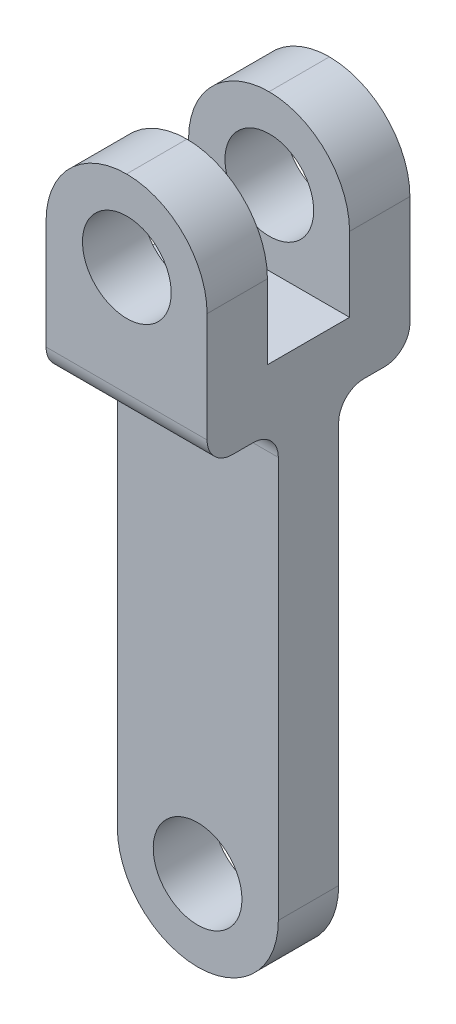
ISO-10303-21;
HEADER;
FILE_DESCRIPTION(('STEP AP214'),'2;1');
FILE_NAME('part.step','',(''),(''),'','','');
FILE_SCHEMA(('AUTOMOTIVE_DESIGN { 1 0 10303 214 1 1 1 1 }'));
ENDSEC;
DATA;
#1=APPLICATION_CONTEXT('core data for automotive mechanical design processes');
#2=APPLICATION_PROTOCOL_DEFINITION('international standard','automotive_design',2000,#1);
#3=PRODUCT_CONTEXT('',#1,'mechanical');
#4=PRODUCT('Part','Part','',(#3));
#5=PRODUCT_RELATED_PRODUCT_CATEGORY('part','',(#4));
#6=PRODUCT_DEFINITION_FORMATION('','',#4);
#7=PRODUCT_DEFINITION_CONTEXT('part definition',#1,'design');
#8=PRODUCT_DEFINITION('design','',#6,#7);
#9=PRODUCT_DEFINITION_SHAPE('','',#8);
#10=(LENGTH_UNIT() NAMED_UNIT(*) SI_UNIT(.MILLI.,.METRE.));
#11=(NAMED_UNIT(*) PLANE_ANGLE_UNIT() SI_UNIT($,.RADIAN.));
#12=(NAMED_UNIT(*) SI_UNIT($,.STERADIAN.) SOLID_ANGLE_UNIT());
#13=UNCERTAINTY_MEASURE_WITH_UNIT(LENGTH_MEASURE(1.E-05),#10,'distance_accuracy_value','');
#14=(GEOMETRIC_REPRESENTATION_CONTEXT(3) GLOBAL_UNCERTAINTY_ASSIGNED_CONTEXT((#13)) GLOBAL_UNIT_ASSIGNED_CONTEXT((#10,
#11,#12)) REPRESENTATION_CONTEXT('',''));
#15=CARTESIAN_POINT('',(0.,0.,0.));
#16=DIRECTION('',(0.,0.,1.));
#17=DIRECTION('',(1.,0.,0.));
#18=AXIS2_PLACEMENT_3D('',#15,#16,#17);
#19=CARTESIAN_POINT('',(6.35,0.,8.));
#20=DIRECTION('',(0.,1.,0.));
#21=DIRECTION('',(0.,0.,-1.));
#22=AXIS2_PLACEMENT_3D('',#19,#20,#21);
#23=PLANE('',#22);
#24=DIRECTION('',(0.,0.,1.));
#25=VECTOR('',#24,1.);
#26=CARTESIAN_POINT('',(6.35,0.,8.));
#27=LINE('',#26,#25);
#28=CARTESIAN_POINT('',(6.35,0.,4.38));
#29=VERTEX_POINT('',#28);
#30=CARTESIAN_POINT('',(6.35,0.,6.));
#31=VERTEX_POINT('',#30);
#32=EDGE_CURVE('E204',#29,#31,#27,.T.);
#33=ORIENTED_EDGE('',*,*,#32,.T.);
#34=DIRECTION('',(-1.,0.,0.));
#35=VECTOR('',#34,1.);
#36=CARTESIAN_POINT('',(6.35,0.,6.));
#37=LINE('',#36,#35);
#38=CARTESIAN_POINT('',(-6.35,0.,6.));
#39=VERTEX_POINT('',#38);
#40=EDGE_CURVE('E297',#39,#31,#37,.F.);
#41=ORIENTED_EDGE('',*,*,#40,.F.);
#42=DIRECTION('',(0.,0.,1.));
#43=VECTOR('',#42,1.);
#44=CARTESIAN_POINT('',(-6.35,0.,8.));
#45=LINE('',#44,#43);
#46=CARTESIAN_POINT('',(-6.35,0.,4.38));
#47=VERTEX_POINT('',#46);
#48=EDGE_CURVE('E220',#47,#39,#45,.T.);
#49=ORIENTED_EDGE('',*,*,#48,.F.);
#50=DIRECTION('',(1.,0.,0.));
#51=VECTOR('',#50,1.);
#52=CARTESIAN_POINT('',(-6.35,0.,4.38));
#53=LINE('',#52,#51);
#54=EDGE_CURVE('E299',#29,#47,#53,.F.);
#55=ORIENTED_EDGE('',*,*,#54,.F.);
#56=EDGE_LOOP('',(#33,#41,#49,#55));
#57=FACE_BOUND('',#56,.T.);
#58=ADVANCED_FACE('F35',(#57),#23,.F.);
#59=CARTESIAN_POINT('',(6.35,17.,8.));
#60=DIRECTION('',(0.,0.,-1.));
#61=DIRECTION('',(0.,-1.,0.));
#62=AXIS2_PLACEMENT_3D('',#59,#60,#61);
#63=PLANE('',#62);
#64=CARTESIAN_POINT('',(0.0200000000000001,10.63,8.));
#65=DIRECTION('',(0.,0.,-1.));
#66=DIRECTION('',(0.,1.,0.));
#67=AXIS2_PLACEMENT_3D('',#64,#65,#66);
#68=CIRCLE('',#67,3.5);
#69=CARTESIAN_POINT('',(0.0200000000000001,14.13,8.));
#70=VERTEX_POINT('',#69);
#71=EDGE_CURVE('E338',#70,#70,#68,.T.);
#72=ORIENTED_EDGE('',*,*,#71,.T.);
#73=EDGE_LOOP('',(#72));
#74=FACE_BOUND('',#73,.T.);
#75=DIRECTION('',(0.,1.,0.));
#76=VECTOR('',#75,1.);
#77=CARTESIAN_POINT('',(6.35,17.,8.));
#78=LINE('',#77,#76);
#79=CARTESIAN_POINT('',(6.35,2.,8.));
#80=VERTEX_POINT('',#79);
#81=CARTESIAN_POINT('',(6.35,10.63,8.));
#82=VERTEX_POINT('',#81);
#83=EDGE_CURVE('E193',#80,#82,#78,.T.);
#84=ORIENTED_EDGE('',*,*,#83,.T.);
#85=CARTESIAN_POINT('',(-0.0200000000000001,10.63,8.));
#86=DIRECTION('',(0.,0.,1.));
#87=DIRECTION('',(0.,-1.,0.));
#88=AXIS2_PLACEMENT_3D('',#85,#86,#87);
#89=CIRCLE('',#88,6.37);
#90=CARTESIAN_POINT('',(0.,16.9999686027484,8.));
#91=VERTEX_POINT('',#90);
#92=EDGE_CURVE('E227',#91,#82,#89,.F.);
#93=ORIENTED_EDGE('',*,*,#92,.F.);
#94=CARTESIAN_POINT('',(0.0200000000000001,10.63,8.));
#95=DIRECTION('',(0.,0.,1.));
#96=DIRECTION('',(0.,-1.,0.));
#97=AXIS2_PLACEMENT_3D('',#94,#95,#96);
#98=CIRCLE('',#97,6.37);
#99=CARTESIAN_POINT('',(-6.35,10.63,8.));
#100=VERTEX_POINT('',#99);
#101=EDGE_CURVE('E230',#100,#91,#98,.F.);
#102=ORIENTED_EDGE('',*,*,#101,.F.);
#103=DIRECTION('',(0.,1.,0.));
#104=VECTOR('',#103,1.);
#105=CARTESIAN_POINT('',(-6.35,17.,8.));
#106=LINE('',#105,#104);
#107=CARTESIAN_POINT('',(-6.35,2.,8.));
#108=VERTEX_POINT('',#107);
#109=EDGE_CURVE('E208',#108,#100,#106,.T.);
#110=ORIENTED_EDGE('',*,*,#109,.F.);
#111=DIRECTION('',(-1.,0.,0.));
#112=VECTOR('',#111,1.);
#113=CARTESIAN_POINT('',(6.35,2.,8.));
#114=LINE('',#113,#112);
#115=EDGE_CURVE('E302',#80,#108,#114,.T.);
#116=ORIENTED_EDGE('',*,*,#115,.F.);
#117=EDGE_LOOP('',(#84,#93,#102,#110,#116));
#118=FACE_BOUND('',#117,.T.);
#119=ADVANCED_FACE('F358',(#74,#118),#63,.F.);
#120=CARTESIAN_POINT('',(6.35,17.,3.24));
#121=DIRECTION('',(0.,0.,-1.));
#122=DIRECTION('',(0.,-1.,0.));
#123=AXIS2_PLACEMENT_3D('',#120,#121,#122);
#124=PLANE('',#123);
#125=CARTESIAN_POINT('',(0.0200000000000001,10.63,3.24));
#126=DIRECTION('',(0.,0.,1.));
#127=DIRECTION('',(0.,-1.,0.));
#128=AXIS2_PLACEMENT_3D('',#125,#126,#127);
#129=CIRCLE('',#128,3.5);
#130=CARTESIAN_POINT('',(0.0200000000000001,7.13,3.24));
#131=VERTEX_POINT('',#130);
#132=EDGE_CURVE('E257',#131,#131,#129,.T.);
#133=ORIENTED_EDGE('',*,*,#132,.T.);
#134=EDGE_LOOP('',(#133));
#135=FACE_BOUND('',#134,.T.);
#136=CARTESIAN_POINT('',(-0.0200000000000001,10.63,3.24));
#137=DIRECTION('',(0.,0.,1.));
#138=DIRECTION('',(0.,-1.,0.));
#139=AXIS2_PLACEMENT_3D('',#136,#137,#138);
#140=CIRCLE('',#139,6.37);
#141=CARTESIAN_POINT('',(6.35,10.63,3.24));
#142=VERTEX_POINT('',#141);
#143=CARTESIAN_POINT('',(0.,16.9999686027484,3.24));
#144=VERTEX_POINT('',#143);
#145=EDGE_CURVE('E192',#142,#144,#140,.T.);
#146=ORIENTED_EDGE('',*,*,#145,.F.);
#147=DIRECTION('',(0.,1.,0.));
#148=VECTOR('',#147,1.);
#149=CARTESIAN_POINT('',(6.35,17.,3.24));
#150=LINE('',#149,#148);
#151=CARTESIAN_POINT('',(6.35,4.76,3.24));
#152=VERTEX_POINT('',#151);
#153=EDGE_CURVE('E170',#152,#142,#150,.T.);
#154=ORIENTED_EDGE('',*,*,#153,.F.);
#155=DIRECTION('',(-1.,0.,0.));
#156=VECTOR('',#155,1.);
#157=CARTESIAN_POINT('',(6.35,4.76,3.24));
#158=LINE('',#157,#156);
#159=CARTESIAN_POINT('',(-6.35,4.76,3.24));
#160=VERTEX_POINT('',#159);
#161=EDGE_CURVE('E179',#152,#160,#158,.T.);
#162=ORIENTED_EDGE('',*,*,#161,.T.);
#163=DIRECTION('',(0.,1.,0.));
#164=VECTOR('',#163,1.);
#165=CARTESIAN_POINT('',(-6.35,17.,3.24));
#166=LINE('',#165,#164);
#167=CARTESIAN_POINT('',(-6.35,10.63,3.24));
#168=VERTEX_POINT('',#167);
#169=EDGE_CURVE('E211',#160,#168,#166,.T.);
#170=ORIENTED_EDGE('',*,*,#169,.T.);
#171=CARTESIAN_POINT('',(0.0200000000000001,10.63,3.24));
#172=DIRECTION('',(0.,0.,1.));
#173=DIRECTION('',(0.,-1.,0.));
#174=AXIS2_PLACEMENT_3D('',#171,#172,#173);
#175=CIRCLE('',#174,6.37);
#176=EDGE_CURVE('E234',#144,#168,#175,.T.);
#177=ORIENTED_EDGE('',*,*,#176,.F.);
#178=EDGE_LOOP('',(#146,#154,#162,#170,#177));
#179=FACE_BOUND('',#178,.T.);
#180=ADVANCED_FACE('F189',(#135,#179),#124,.T.);
#181=CARTESIAN_POINT('',(6.35,4.76,8.));
#182=DIRECTION('',(0.,1.,0.));
#183=DIRECTION('',(0.,0.,-1.));
#184=AXIS2_PLACEMENT_3D('',#181,#182,#183);
#185=PLANE('',#184);
#186=DIRECTION('',(0.,0.,1.));
#187=VECTOR('',#186,1.);
#188=CARTESIAN_POINT('',(-6.35,4.76,8.));
#189=LINE('',#188,#187);
#190=CARTESIAN_POINT('',(-6.35,4.76,-3.24));
#191=VERTEX_POINT('',#190);
#192=EDGE_CURVE('E182',#191,#160,#189,.T.);
#193=ORIENTED_EDGE('',*,*,#192,.T.);
#194=ORIENTED_EDGE('',*,*,#161,.F.);
#195=DIRECTION('',(0.,0.,1.));
#196=VECTOR('',#195,1.);
#197=CARTESIAN_POINT('',(6.35,4.76,8.));
#198=LINE('',#197,#196);
#199=CARTESIAN_POINT('',(6.35,4.76,-3.24));
#200=VERTEX_POINT('',#199);
#201=EDGE_CURVE('E165',#200,#152,#198,.T.);
#202=ORIENTED_EDGE('',*,*,#201,.F.);
#203=DIRECTION('',(-1.,0.,0.));
#204=VECTOR('',#203,1.);
#205=CARTESIAN_POINT('',(6.35,4.76,-3.24));
#206=LINE('',#205,#204);
#207=EDGE_CURVE('E187',#200,#191,#206,.T.);
#208=ORIENTED_EDGE('',*,*,#207,.T.);
#209=EDGE_LOOP('',(#193,#194,#202,#208));
#210=FACE_BOUND('',#209,.T.);
#211=ADVANCED_FACE('F180',(#210),#185,.T.);
#212=CARTESIAN_POINT('',(6.35,17.,-3.24));
#213=DIRECTION('',(0.,0.,1.));
#214=DIRECTION('',(0.,1.,0.));
#215=AXIS2_PLACEMENT_3D('',#212,#213,#214);
#216=PLANE('',#215);
#217=CARTESIAN_POINT('',(0.0200000000000001,10.63,-3.24));
#218=DIRECTION('',(0.,0.,-1.));
#219=DIRECTION('',(0.,1.,0.));
#220=AXIS2_PLACEMENT_3D('',#217,#218,#219);
#221=CIRCLE('',#220,3.5);
#222=CARTESIAN_POINT('',(0.0200000000000001,14.13,-3.24));
#223=VERTEX_POINT('',#222);
#224=EDGE_CURVE('E342',#223,#223,#221,.T.);
#225=ORIENTED_EDGE('',*,*,#224,.T.);
#226=EDGE_LOOP('',(#225));
#227=FACE_BOUND('',#226,.T.);
#228=DIRECTION('',(0.,-1.,0.));
#229=VECTOR('',#228,1.);
#230=CARTESIAN_POINT('',(-6.35,17.,-3.24));
#231=LINE('',#230,#229);
#232=CARTESIAN_POINT('',(-6.35,10.63,-3.24));
#233=VERTEX_POINT('',#232);
#234=EDGE_CURVE('E215',#233,#191,#231,.T.);
#235=ORIENTED_EDGE('',*,*,#234,.T.);
#236=ORIENTED_EDGE('',*,*,#207,.F.);
#237=DIRECTION('',(0.,-1.,0.));
#238=VECTOR('',#237,1.);
#239=CARTESIAN_POINT('',(6.35,17.,-3.24));
#240=LINE('',#239,#238);
#241=CARTESIAN_POINT('',(6.35,10.63,-3.24));
#242=VERTEX_POINT('',#241);
#243=EDGE_CURVE('E173',#242,#200,#240,.T.);
#244=ORIENTED_EDGE('',*,*,#243,.F.);
#245=CARTESIAN_POINT('',(-0.0200000000000001,10.63,-3.24));
#246=DIRECTION('',(0.,0.,-1.));
#247=DIRECTION('',(0.,1.,0.));
#248=AXIS2_PLACEMENT_3D('',#245,#246,#247);
#249=CIRCLE('',#248,6.37);
#250=CARTESIAN_POINT('',(0.,16.9999686027484,-3.24));
#251=VERTEX_POINT('',#250);
#252=EDGE_CURVE('E237',#251,#242,#249,.T.);
#253=ORIENTED_EDGE('',*,*,#252,.F.);
#254=CARTESIAN_POINT('',(0.0200000000000001,10.63,-3.24));
#255=DIRECTION('',(0.,0.,-1.));
#256=DIRECTION('',(0.,1.,0.));
#257=AXIS2_PLACEMENT_3D('',#254,#255,#256);
#258=CIRCLE('',#257,6.37);
#259=EDGE_CURVE('E240',#233,#251,#258,.T.);
#260=ORIENTED_EDGE('',*,*,#259,.F.);
#261=EDGE_LOOP('',(#235,#236,#244,#253,#260));
#262=FACE_BOUND('',#261,.T.);
#263=ADVANCED_FACE('F372',(#227,#262),#216,.T.);
#264=CARTESIAN_POINT('',(6.35,17.,-8.));
#265=DIRECTION('',(0.,0.,1.));
#266=DIRECTION('',(0.,1.,0.));
#267=AXIS2_PLACEMENT_3D('',#264,#265,#266);
#268=PLANE('',#267);
#269=CARTESIAN_POINT('',(0.0200000000000001,10.63,-8.));
#270=DIRECTION('',(0.,0.,-1.));
#271=DIRECTION('',(0.,1.,0.));
#272=AXIS2_PLACEMENT_3D('',#269,#270,#271);
#273=CIRCLE('',#272,3.5);
#274=CARTESIAN_POINT('',(0.0200000000000001,14.13,-8.));
#275=VERTEX_POINT('',#274);
#276=EDGE_CURVE('E339',#275,#275,#273,.T.);
#277=ORIENTED_EDGE('',*,*,#276,.F.);
#278=EDGE_LOOP('',(#277));
#279=FACE_BOUND('',#278,.T.);
#280=DIRECTION('',(0.,-1.,0.));
#281=VECTOR('',#280,1.);
#282=CARTESIAN_POINT('',(-6.35,17.,-8.));
#283=LINE('',#282,#281);
#284=CARTESIAN_POINT('',(-6.35,10.63,-8.));
#285=VERTEX_POINT('',#284);
#286=CARTESIAN_POINT('',(-6.35,2.,-8.));
#287=VERTEX_POINT('',#286);
#288=EDGE_CURVE('E217',#285,#287,#283,.T.);
#289=ORIENTED_EDGE('',*,*,#288,.F.);
#290=CARTESIAN_POINT('',(0.0200000000000001,10.63,-8.));
#291=DIRECTION('',(0.,0.,-1.));
#292=DIRECTION('',(0.,1.,0.));
#293=AXIS2_PLACEMENT_3D('',#290,#291,#292);
#294=CIRCLE('',#293,6.37);
#295=CARTESIAN_POINT('',(0.,16.9999686027484,-8.));
#296=VERTEX_POINT('',#295);
#297=EDGE_CURVE('E246',#296,#285,#294,.F.);
#298=ORIENTED_EDGE('',*,*,#297,.F.);
#299=CARTESIAN_POINT('',(-0.0200000000000001,10.63,-8.));
#300=DIRECTION('',(0.,0.,-1.));
#301=DIRECTION('',(0.,1.,0.));
#302=AXIS2_PLACEMENT_3D('',#299,#300,#301);
#303=CIRCLE('',#302,6.37);
#304=CARTESIAN_POINT('',(6.35,10.63,-8.));
#305=VERTEX_POINT('',#304);
#306=EDGE_CURVE('E243',#305,#296,#303,.F.);
#307=ORIENTED_EDGE('',*,*,#306,.F.);
#308=DIRECTION('',(0.,-1.,0.));
#309=VECTOR('',#308,1.);
#310=CARTESIAN_POINT('',(6.35,17.,-8.));
#311=LINE('',#310,#309);
#312=CARTESIAN_POINT('',(6.35,2.,-8.));
#313=VERTEX_POINT('',#312);
#314=EDGE_CURVE('E201',#305,#313,#311,.T.);
#315=ORIENTED_EDGE('',*,*,#314,.T.);
#316=DIRECTION('',(-1.,0.,0.));
#317=VECTOR('',#316,1.);
#318=CARTESIAN_POINT('',(6.35,2.,-8.));
#319=LINE('',#318,#317);
#320=EDGE_CURVE('E289',#287,#313,#319,.F.);
#321=ORIENTED_EDGE('',*,*,#320,.F.);
#322=EDGE_LOOP('',(#289,#298,#307,#315,#321));
#323=FACE_BOUND('',#322,.T.);
#324=ADVANCED_FACE('F381',(#279,#323),#268,.F.);
#325=CARTESIAN_POINT('',(-6.35,0.,-6.));
#326=VERTEX_POINT('',#325);
#327=CARTESIAN_POINT('',(-6.35,0.,-4.38));
#328=VERTEX_POINT('',#327);
#329=EDGE_CURVE('E196',#326,#328,#45,.T.);
#330=ORIENTED_EDGE('',*,*,#329,.F.);
#331=DIRECTION('',(-1.,0.,0.));
#332=VECTOR('',#331,1.);
#333=CARTESIAN_POINT('',(6.35,0.,-6.));
#334=LINE('',#333,#332);
#335=CARTESIAN_POINT('',(6.35,0.,-6.));
#336=VERTEX_POINT('',#335);
#337=EDGE_CURVE('E273',#336,#326,#334,.T.);
#338=ORIENTED_EDGE('',*,*,#337,.F.);
#339=CARTESIAN_POINT('',(6.35,0.,-4.38));
#340=VERTEX_POINT('',#339);
#341=EDGE_CURVE('E207',#336,#340,#27,.T.);
#342=ORIENTED_EDGE('',*,*,#341,.T.);
#343=DIRECTION('',(1.,0.,0.));
#344=VECTOR('',#343,1.);
#345=CARTESIAN_POINT('',(6.35,0.,-4.38));
#346=LINE('',#345,#344);
#347=EDGE_CURVE('E280',#328,#340,#346,.T.);
#348=ORIENTED_EDGE('',*,*,#347,.F.);
#349=EDGE_LOOP('',(#330,#338,#342,#348));
#350=FACE_BOUND('',#349,.T.);
#351=ADVANCED_FACE('F391',(#350),#23,.F.);
#352=CARTESIAN_POINT('',(6.35,0.,0.));
#353=DIRECTION('',(-1.,0.,0.));
#354=DIRECTION('',(0.,0.,-1.));
#355=AXIS2_PLACEMENT_3D('',#352,#353,#354);
#356=PLANE('',#355);
#357=ORIENTED_EDGE('',*,*,#314,.F.);
#358=DIRECTION('',(0.,0.,1.));
#359=VECTOR('',#358,1.);
#360=CARTESIAN_POINT('',(6.35,10.63,-8.));
#361=LINE('',#360,#359);
#362=EDGE_CURVE('E251',#242,#305,#361,.F.);
#363=ORIENTED_EDGE('',*,*,#362,.F.);
#364=ORIENTED_EDGE('',*,*,#243,.T.);
#365=ORIENTED_EDGE('',*,*,#201,.T.);
#366=ORIENTED_EDGE('',*,*,#153,.T.);
#367=DIRECTION('',(0.,0.,1.));
#368=VECTOR('',#367,1.);
#369=CARTESIAN_POINT('',(6.35,10.63,3.24));
#370=LINE('',#369,#368);
#371=EDGE_CURVE('E249',#82,#142,#370,.F.);
#372=ORIENTED_EDGE('',*,*,#371,.F.);
#373=ORIENTED_EDGE('',*,*,#83,.F.);
#374=CARTESIAN_POINT('',(6.35,2.,6.));
#375=DIRECTION('',(1.,0.,0.));
#376=DIRECTION('',(0.,0.,-1.));
#377=AXIS2_PLACEMENT_3D('',#374,#375,#376);
#378=CIRCLE('',#377,2.);
#379=EDGE_CURVE('E50',#31,#80,#378,.F.);
#380=ORIENTED_EDGE('',*,*,#379,.F.);
#381=ORIENTED_EDGE('',*,*,#32,.F.);
#382=CARTESIAN_POINT('',(6.35,-2.,4.38));
#383=DIRECTION('',(1.,0.,0.));
#384=DIRECTION('',(0.,0.,-1.));
#385=AXIS2_PLACEMENT_3D('',#382,#383,#384);
#386=CIRCLE('',#385,2.);
#387=CARTESIAN_POINT('',(6.35,-2.,2.38));
#388=VERTEX_POINT('',#387);
#389=EDGE_CURVE('E43',#388,#29,#386,.T.);
#390=ORIENTED_EDGE('',*,*,#389,.F.);
#391=DIRECTION('',(0.,1.,0.));
#392=VECTOR('',#391,1.);
#393=CARTESIAN_POINT('',(6.35,-40.,2.38));
#394=LINE('',#393,#392);
#395=CARTESIAN_POINT('',(6.35,-33.63,2.38));
#396=VERTEX_POINT('',#395);
#397=EDGE_CURVE('E336',#396,#388,#394,.T.);
#398=ORIENTED_EDGE('',*,*,#397,.F.);
#399=DIRECTION('',(0.,0.,1.));
#400=VECTOR('',#399,1.);
#401=CARTESIAN_POINT('',(6.35,-33.63,0.));
#402=LINE('',#401,#400);
#403=CARTESIAN_POINT('',(6.35,-33.63,-2.38));
#404=VERTEX_POINT('',#403);
#405=EDGE_CURVE('E270',#404,#396,#402,.T.);
#406=ORIENTED_EDGE('',*,*,#405,.F.);
#407=DIRECTION('',(0.,1.,0.));
#408=VECTOR('',#407,1.);
#409=CARTESIAN_POINT('',(6.35,-40.,-2.38));
#410=LINE('',#409,#408);
#411=CARTESIAN_POINT('',(6.35,-2.,-2.38));
#412=VERTEX_POINT('',#411);
#413=EDGE_CURVE('E329',#404,#412,#410,.T.);
#414=ORIENTED_EDGE('',*,*,#413,.T.);
#415=CARTESIAN_POINT('',(6.35,-2.,-4.38));
#416=DIRECTION('',(1.,0.,0.));
#417=DIRECTION('',(0.,0.,-1.));
#418=AXIS2_PLACEMENT_3D('',#415,#416,#417);
#419=CIRCLE('',#418,2.);
#420=EDGE_CURVE('E304',#340,#412,#419,.T.);
#421=ORIENTED_EDGE('',*,*,#420,.F.);
#422=ORIENTED_EDGE('',*,*,#341,.F.);
#423=CARTESIAN_POINT('',(6.35,2.,-6.));
#424=DIRECTION('',(1.,0.,0.));
#425=DIRECTION('',(0.,0.,-1.));
#426=AXIS2_PLACEMENT_3D('',#423,#424,#425);
#427=CIRCLE('',#426,2.);
#428=EDGE_CURVE('E293',#313,#336,#427,.F.);
#429=ORIENTED_EDGE('',*,*,#428,.F.);
#430=EDGE_LOOP('',(#357,#363,#364,#365,#366,#372,#373,#380,#381,#390,#398,#406,#414,#421,#422,#429));
#431=FACE_BOUND('',#430,.T.);
#432=ADVANCED_FACE('F168',(#431),#356,.F.);
#433=CARTESIAN_POINT('',(-6.35,0.,0.));
#434=DIRECTION('',(-1.,0.,0.));
#435=DIRECTION('',(0.,0.,-1.));
#436=AXIS2_PLACEMENT_3D('',#433,#434,#435);
#437=PLANE('',#436);
#438=ORIENTED_EDGE('',*,*,#329,.T.);
#439=CARTESIAN_POINT('',(-6.35,-2.,-4.38));
#440=DIRECTION('',(1.,0.,0.));
#441=DIRECTION('',(0.,0.,-1.));
#442=AXIS2_PLACEMENT_3D('',#439,#440,#441);
#443=CIRCLE('',#442,2.);
#444=CARTESIAN_POINT('',(-6.35,-2.,-2.38));
#445=VERTEX_POINT('',#444);
#446=EDGE_CURVE('E307',#445,#328,#443,.F.);
#447=ORIENTED_EDGE('',*,*,#446,.F.);
#448=DIRECTION('',(0.,1.,0.));
#449=VECTOR('',#448,1.);
#450=CARTESIAN_POINT('',(-6.35,-40.,-2.38));
#451=LINE('',#450,#449);
#452=CARTESIAN_POINT('',(-6.35,-33.63,-2.38));
#453=VERTEX_POINT('',#452);
#454=EDGE_CURVE('E326',#453,#445,#451,.T.);
#455=ORIENTED_EDGE('',*,*,#454,.F.);
#456=DIRECTION('',(0.,0.,-1.));
#457=VECTOR('',#456,1.);
#458=CARTESIAN_POINT('',(-6.35,-33.63,-2.38));
#459=LINE('',#458,#457);
#460=CARTESIAN_POINT('',(-6.35,-33.63,2.38));
#461=VERTEX_POINT('',#460);
#462=EDGE_CURVE('E253',#461,#453,#459,.T.);
#463=ORIENTED_EDGE('',*,*,#462,.F.);
#464=DIRECTION('',(0.,1.,0.));
#465=VECTOR('',#464,1.);
#466=CARTESIAN_POINT('',(-6.35,-40.,2.38));
#467=LINE('',#466,#465);
#468=CARTESIAN_POINT('',(-6.35,-2.,2.38));
#469=VERTEX_POINT('',#468);
#470=EDGE_CURVE('E276',#461,#469,#467,.T.);
#471=ORIENTED_EDGE('',*,*,#470,.T.);
#472=CARTESIAN_POINT('',(-6.35,-2.,4.38));
#473=DIRECTION('',(1.,0.,0.));
#474=DIRECTION('',(0.,0.,-1.));
#475=AXIS2_PLACEMENT_3D('',#472,#473,#474);
#476=CIRCLE('',#475,2.);
#477=EDGE_CURVE('E11',#47,#469,#476,.F.);
#478=ORIENTED_EDGE('',*,*,#477,.F.);
#479=ORIENTED_EDGE('',*,*,#48,.T.);
#480=CARTESIAN_POINT('',(-6.35,2.,6.));
#481=DIRECTION('',(1.,0.,0.));
#482=DIRECTION('',(0.,0.,-1.));
#483=AXIS2_PLACEMENT_3D('',#480,#481,#482);
#484=CIRCLE('',#483,2.);
#485=EDGE_CURVE('E285',#108,#39,#484,.T.);
#486=ORIENTED_EDGE('',*,*,#485,.F.);
#487=ORIENTED_EDGE('',*,*,#109,.T.);
#488=DIRECTION('',(0.,0.,1.));
#489=VECTOR('',#488,1.);
#490=CARTESIAN_POINT('',(-6.35,10.63,0.));
#491=LINE('',#490,#489);
#492=EDGE_CURVE('E225',#168,#100,#491,.T.);
#493=ORIENTED_EDGE('',*,*,#492,.F.);
#494=ORIENTED_EDGE('',*,*,#169,.F.);
#495=ORIENTED_EDGE('',*,*,#192,.F.);
#496=ORIENTED_EDGE('',*,*,#234,.F.);
#497=DIRECTION('',(0.,0.,1.));
#498=VECTOR('',#497,1.);
#499=CARTESIAN_POINT('',(-6.35,10.63,0.));
#500=LINE('',#499,#498);
#501=EDGE_CURVE('E186',#285,#233,#500,.T.);
#502=ORIENTED_EDGE('',*,*,#501,.F.);
#503=ORIENTED_EDGE('',*,*,#288,.T.);
#504=CARTESIAN_POINT('',(-6.35,2.,-6.));
#505=DIRECTION('',(1.,0.,0.));
#506=DIRECTION('',(0.,0.,-1.));
#507=AXIS2_PLACEMENT_3D('',#504,#505,#506);
#508=CIRCLE('',#507,2.);
#509=EDGE_CURVE('E287',#326,#287,#508,.T.);
#510=ORIENTED_EDGE('',*,*,#509,.F.);
#511=EDGE_LOOP('',(#438,#447,#455,#463,#471,#478,#479,#486,#487,#493,#494,#495,#496,#502,#503,#510));
#512=FACE_BOUND('',#511,.T.);
#513=ADVANCED_FACE('F319',(#512),#437,.T.);
#514=CARTESIAN_POINT('',(-0.0200000000000001,10.63,3.24));
#515=DIRECTION('',(0.,0.,-1.));
#516=DIRECTION('',(1.,0.,0.));
#517=AXIS2_PLACEMENT_3D('',#514,#515,#516);
#518=CYLINDRICAL_SURFACE('',#517,6.37);
#519=DIRECTION('',(0.,0.,-1.));
#520=VECTOR('',#519,1.);
#521=CARTESIAN_POINT('',(0.,16.9999686027484,5.62));
#522=LINE('',#521,#520);
#523=EDGE_CURVE('E212',#144,#91,#522,.F.);
#524=ORIENTED_EDGE('',*,*,#523,.T.);
#525=ORIENTED_EDGE('',*,*,#92,.T.);
#526=ORIENTED_EDGE('',*,*,#371,.T.);
#527=ORIENTED_EDGE('',*,*,#145,.T.);
#528=EDGE_LOOP('',(#524,#525,#526,#527));
#529=FACE_BOUND('',#528,.T.);
#530=ADVANCED_FACE('F366',(#529),#518,.T.);
#531=CARTESIAN_POINT('',(0.0200000000000001,10.63,0.));
#532=DIRECTION('',(0.,0.,1.));
#533=DIRECTION('',(-1.,0.,0.));
#534=AXIS2_PLACEMENT_3D('',#531,#532,#533);
#535=CYLINDRICAL_SURFACE('',#534,6.37);
#536=ORIENTED_EDGE('',*,*,#176,.T.);
#537=ORIENTED_EDGE('',*,*,#492,.T.);
#538=ORIENTED_EDGE('',*,*,#101,.T.);
#539=ORIENTED_EDGE('',*,*,#523,.F.);
#540=EDGE_LOOP('',(#536,#537,#538,#539));
#541=FACE_BOUND('',#540,.T.);
#542=ADVANCED_FACE('F368',(#541),#535,.T.);
#543=CARTESIAN_POINT('',(-0.0200000000000001,10.63,-8.));
#544=DIRECTION('',(0.,0.,-1.));
#545=DIRECTION('',(1.,0.,0.));
#546=AXIS2_PLACEMENT_3D('',#543,#544,#545);
#547=CYLINDRICAL_SURFACE('',#546,6.37);
#548=DIRECTION('',(0.,0.,-1.));
#549=VECTOR('',#548,1.);
#550=CARTESIAN_POINT('',(0.,16.9999686027484,-5.62));
#551=LINE('',#550,#549);
#552=EDGE_CURVE('E255',#296,#251,#551,.F.);
#553=ORIENTED_EDGE('',*,*,#552,.T.);
#554=ORIENTED_EDGE('',*,*,#252,.T.);
#555=ORIENTED_EDGE('',*,*,#362,.T.);
#556=ORIENTED_EDGE('',*,*,#306,.T.);
#557=EDGE_LOOP('',(#553,#554,#555,#556));
#558=FACE_BOUND('',#557,.T.);
#559=ADVANCED_FACE('F404',(#558),#547,.T.);
#560=CARTESIAN_POINT('',(0.0200000000000001,10.63,0.));
#561=DIRECTION('',(0.,0.,1.));
#562=DIRECTION('',(-1.,0.,0.));
#563=AXIS2_PLACEMENT_3D('',#560,#561,#562);
#564=CYLINDRICAL_SURFACE('',#563,6.37);
#565=ORIENTED_EDGE('',*,*,#297,.T.);
#566=ORIENTED_EDGE('',*,*,#501,.T.);
#567=ORIENTED_EDGE('',*,*,#259,.T.);
#568=ORIENTED_EDGE('',*,*,#552,.F.);
#569=EDGE_LOOP('',(#565,#566,#567,#568));
#570=FACE_BOUND('',#569,.T.);
#571=ADVANCED_FACE('F375',(#570),#564,.T.);
#572=CARTESIAN_POINT('',(0.0200000000000001,10.63,-8.));
#573=DIRECTION('',(0.,0.,1.));
#574=DIRECTION('',(0.,1.,0.));
#575=AXIS2_PLACEMENT_3D('',#572,#573,#574);
#576=CYLINDRICAL_SURFACE('',#575,3.5);
#577=ORIENTED_EDGE('',*,*,#224,.F.);
#578=EDGE_LOOP('',(#577));
#579=FACE_BOUND('',#578,.T.);
#580=ORIENTED_EDGE('',*,*,#276,.T.);
#581=EDGE_LOOP('',(#580));
#582=FACE_BOUND('',#581,.T.);
#583=ADVANCED_FACE('F354',(#579,#582),#576,.F.);
#584=ORIENTED_EDGE('',*,*,#132,.F.);
#585=EDGE_LOOP('',(#584));
#586=FACE_BOUND('',#585,.T.);
#587=ORIENTED_EDGE('',*,*,#71,.F.);
#588=EDGE_LOOP('',(#587));
#589=FACE_BOUND('',#588,.T.);
#590=ADVANCED_FACE('F350',(#586,#589),#576,.F.);
#591=CARTESIAN_POINT('',(-6.35,-40.,2.38));
#592=DIRECTION('',(0.,0.,-1.));
#593=DIRECTION('',(0.,-1.,0.));
#594=AXIS2_PLACEMENT_3D('',#591,#592,#593);
#595=PLANE('',#594);
#596=CARTESIAN_POINT('',(-0.0200000000000001,-33.63,2.38));
#597=DIRECTION('',(0.,0.,1.));
#598=DIRECTION('',(0.,-1.,0.));
#599=AXIS2_PLACEMENT_3D('',#596,#597,#598);
#600=CIRCLE('',#599,3.5);
#601=CARTESIAN_POINT('',(-0.0200000000000001,-37.13,2.38));
#602=VERTEX_POINT('',#601);
#603=EDGE_CURVE('E277',#602,#602,#600,.T.);
#604=ORIENTED_EDGE('',*,*,#603,.F.);
#605=EDGE_LOOP('',(#604));
#606=FACE_BOUND('',#605,.T.);
#607=ORIENTED_EDGE('',*,*,#470,.F.);
#608=CARTESIAN_POINT('',(0.0200000000000001,-33.63,2.38));
#609=DIRECTION('',(0.,0.,1.));
#610=DIRECTION('',(0.,-1.,0.));
#611=AXIS2_PLACEMENT_3D('',#608,#609,#610);
#612=CIRCLE('',#611,6.37);
#613=CARTESIAN_POINT('',(0.,-39.9999686027484,2.38));
#614=VERTEX_POINT('',#613);
#615=EDGE_CURVE('E268',#614,#461,#612,.F.);
#616=ORIENTED_EDGE('',*,*,#615,.F.);
#617=CARTESIAN_POINT('',(-0.0200000000000001,-33.63,2.38));
#618=DIRECTION('',(0.,0.,1.));
#619=DIRECTION('',(0.,-1.,0.));
#620=AXIS2_PLACEMENT_3D('',#617,#618,#619);
#621=CIRCLE('',#620,6.37);
#622=EDGE_CURVE('E265',#396,#614,#621,.F.);
#623=ORIENTED_EDGE('',*,*,#622,.F.);
#624=ORIENTED_EDGE('',*,*,#397,.T.);
#625=DIRECTION('',(1.,0.,0.));
#626=VECTOR('',#625,1.);
#627=CARTESIAN_POINT('',(6.35,-2.,2.38));
#628=LINE('',#627,#626);
#629=EDGE_CURVE('E295',#469,#388,#628,.T.);
#630=ORIENTED_EDGE('',*,*,#629,.F.);
#631=EDGE_LOOP('',(#607,#616,#623,#624,#630));
#632=FACE_BOUND('',#631,.T.);
#633=ADVANCED_FACE('F353',(#606,#632),#595,.F.);
#634=CARTESIAN_POINT('',(-6.35,-40.,-2.38));
#635=DIRECTION('',(0.,0.,-1.));
#636=DIRECTION('',(0.,-1.,0.));
#637=AXIS2_PLACEMENT_3D('',#634,#635,#636);
#638=PLANE('',#637);
#639=CARTESIAN_POINT('',(-0.0200000000000001,-33.63,-2.38));
#640=DIRECTION('',(0.,0.,1.));
#641=DIRECTION('',(1.,0.,0.));
#642=AXIS2_PLACEMENT_3D('',#639,#640,#641);
#643=CIRCLE('',#642,3.5);
#644=CARTESIAN_POINT('',(3.48,-33.63,-2.38));
#645=VERTEX_POINT('',#644);
#646=EDGE_CURVE('E464',#645,#645,#643,.T.);
#647=ORIENTED_EDGE('',*,*,#646,.T.);
#648=EDGE_LOOP('',(#647));
#649=FACE_BOUND('',#648,.T.);
#650=ORIENTED_EDGE('',*,*,#413,.F.);
#651=CARTESIAN_POINT('',(-0.0200000000000001,-33.63,-2.38));
#652=DIRECTION('',(0.,0.,1.));
#653=DIRECTION('',(0.,-1.,0.));
#654=AXIS2_PLACEMENT_3D('',#651,#652,#653);
#655=CIRCLE('',#654,6.37);
#656=CARTESIAN_POINT('',(0.,-39.9999686027484,-2.38));
#657=VERTEX_POINT('',#656);
#658=EDGE_CURVE('E260',#657,#404,#655,.T.);
#659=ORIENTED_EDGE('',*,*,#658,.F.);
#660=CARTESIAN_POINT('',(0.0200000000000001,-33.63,-2.38));
#661=DIRECTION('',(0.,0.,1.));
#662=DIRECTION('',(0.,-1.,0.));
#663=AXIS2_PLACEMENT_3D('',#660,#661,#662);
#664=CIRCLE('',#663,6.37);
#665=EDGE_CURVE('E262',#453,#657,#664,.T.);
#666=ORIENTED_EDGE('',*,*,#665,.F.);
#667=ORIENTED_EDGE('',*,*,#454,.T.);
#668=DIRECTION('',(1.,0.,0.));
#669=VECTOR('',#668,1.);
#670=CARTESIAN_POINT('',(-6.35,-2.,-2.38));
#671=LINE('',#670,#669);
#672=EDGE_CURVE('E283',#412,#445,#671,.F.);
#673=ORIENTED_EDGE('',*,*,#672,.F.);
#674=EDGE_LOOP('',(#650,#659,#666,#667,#673));
#675=FACE_BOUND('',#674,.T.);
#676=ADVANCED_FACE('F396',(#649,#675),#638,.T.);
#677=CARTESIAN_POINT('',(-0.0200000000000001,-33.63,0.));
#678=DIRECTION('',(0.,0.,1.));
#679=DIRECTION('',(0.,1.,0.));
#680=AXIS2_PLACEMENT_3D('',#677,#678,#679);
#681=CYLINDRICAL_SURFACE('',#680,6.37);
#682=DIRECTION('',(0.,0.,1.));
#683=VECTOR('',#682,1.);
#684=CARTESIAN_POINT('',(0.,-39.9999686027484,0.));
#685=LINE('',#684,#683);
#686=EDGE_CURVE('E274',#614,#657,#685,.F.);
#687=ORIENTED_EDGE('',*,*,#686,.T.);
#688=ORIENTED_EDGE('',*,*,#658,.T.);
#689=ORIENTED_EDGE('',*,*,#405,.T.);
#690=ORIENTED_EDGE('',*,*,#622,.T.);
#691=EDGE_LOOP('',(#687,#688,#689,#690));
#692=FACE_BOUND('',#691,.T.);
#693=ADVANCED_FACE('F402',(#692),#681,.T.);
#694=CARTESIAN_POINT('',(0.0200000000000001,-33.63,0.));
#695=DIRECTION('',(0.,0.,1.));
#696=DIRECTION('',(0.,1.,0.));
#697=AXIS2_PLACEMENT_3D('',#694,#695,#696);
#698=CYLINDRICAL_SURFACE('',#697,6.37);
#699=ORIENTED_EDGE('',*,*,#615,.T.);
#700=ORIENTED_EDGE('',*,*,#462,.T.);
#701=ORIENTED_EDGE('',*,*,#665,.T.);
#702=ORIENTED_EDGE('',*,*,#686,.F.);
#703=EDGE_LOOP('',(#699,#700,#701,#702));
#704=FACE_BOUND('',#703,.T.);
#705=ADVANCED_FACE('F399',(#704),#698,.T.);
#706=CARTESIAN_POINT('',(-0.0200000000000001,-33.63,8.));
#707=DIRECTION('',(0.,0.,-1.));
#708=DIRECTION('',(1.,0.,0.));
#709=AXIS2_PLACEMENT_3D('',#706,#707,#708);
#710=CYLINDRICAL_SURFACE('',#709,3.5);
#711=ORIENTED_EDGE('',*,*,#646,.F.);
#712=EDGE_LOOP('',(#711));
#713=FACE_BOUND('',#712,.T.);
#714=ORIENTED_EDGE('',*,*,#603,.T.);
#715=EDGE_LOOP('',(#714));
#716=FACE_BOUND('',#715,.T.);
#717=ADVANCED_FACE('F453',(#713,#716),#710,.F.);
#718=CARTESIAN_POINT('',(6.35,-2.,-4.38));
#719=DIRECTION('',(1.,0.,0.));
#720=DIRECTION('',(0.,0.,1.));
#721=AXIS2_PLACEMENT_3D('',#718,#719,#720);
#722=CYLINDRICAL_SURFACE('',#721,2.);
#723=ORIENTED_EDGE('',*,*,#446,.T.);
#724=ORIENTED_EDGE('',*,*,#347,.T.);
#725=ORIENTED_EDGE('',*,*,#420,.T.);
#726=ORIENTED_EDGE('',*,*,#672,.T.);
#727=EDGE_LOOP('',(#723,#724,#725,#726));
#728=FACE_BOUND('',#727,.T.);
#729=ADVANCED_FACE('F393',(#728),#722,.F.);
#730=CARTESIAN_POINT('',(6.35,2.,-6.));
#731=DIRECTION('',(-1.,0.,0.));
#732=DIRECTION('',(0.,0.,-1.));
#733=AXIS2_PLACEMENT_3D('',#730,#731,#732);
#734=CYLINDRICAL_SURFACE('',#733,2.);
#735=ORIENTED_EDGE('',*,*,#428,.T.);
#736=ORIENTED_EDGE('',*,*,#337,.T.);
#737=ORIENTED_EDGE('',*,*,#509,.T.);
#738=ORIENTED_EDGE('',*,*,#320,.T.);
#739=EDGE_LOOP('',(#735,#736,#737,#738));
#740=FACE_BOUND('',#739,.T.);
#741=ADVANCED_FACE('F386',(#740),#734,.T.);
#742=CARTESIAN_POINT('',(-6.35,-2.,4.38));
#743=DIRECTION('',(-1.,0.,0.));
#744=DIRECTION('',(0.,0.,-1.));
#745=AXIS2_PLACEMENT_3D('',#742,#743,#744);
#746=CYLINDRICAL_SURFACE('',#745,2.);
#747=ORIENTED_EDGE('',*,*,#477,.T.);
#748=ORIENTED_EDGE('',*,*,#629,.T.);
#749=ORIENTED_EDGE('',*,*,#389,.T.);
#750=ORIENTED_EDGE('',*,*,#54,.T.);
#751=EDGE_LOOP('',(#747,#748,#749,#750));
#752=FACE_BOUND('',#751,.T.);
#753=ADVANCED_FACE('F311',(#752),#746,.F.);
#754=CARTESIAN_POINT('',(6.35,2.,6.));
#755=DIRECTION('',(-1.,0.,0.));
#756=DIRECTION('',(0.,0.,-1.));
#757=AXIS2_PLACEMENT_3D('',#754,#755,#756);
#758=CYLINDRICAL_SURFACE('',#757,2.);
#759=ORIENTED_EDGE('',*,*,#379,.T.);
#760=ORIENTED_EDGE('',*,*,#115,.T.);
#761=ORIENTED_EDGE('',*,*,#485,.T.);
#762=ORIENTED_EDGE('',*,*,#40,.T.);
#763=EDGE_LOOP('',(#759,#760,#761,#762));
#764=FACE_BOUND('',#763,.T.);
#765=ADVANCED_FACE('F37',(#764),#758,.T.);
#766=CLOSED_SHELL('',(#58,#119,#180,#211,#263,#324,#351,#432,#513,#530,#542,#559,#571,#583,#590,
#633,#676,#693,#705,#717,#729,#741,#753,#765));
#767=MANIFOLD_SOLID_BREP('B2',#766);
#768=ADVANCED_BREP_SHAPE_REPRESENTATION('',(#18,#767),#14);
#769=SHAPE_DEFINITION_REPRESENTATION(#9,#768);
ENDSEC;
END-ISO-10303-21;
